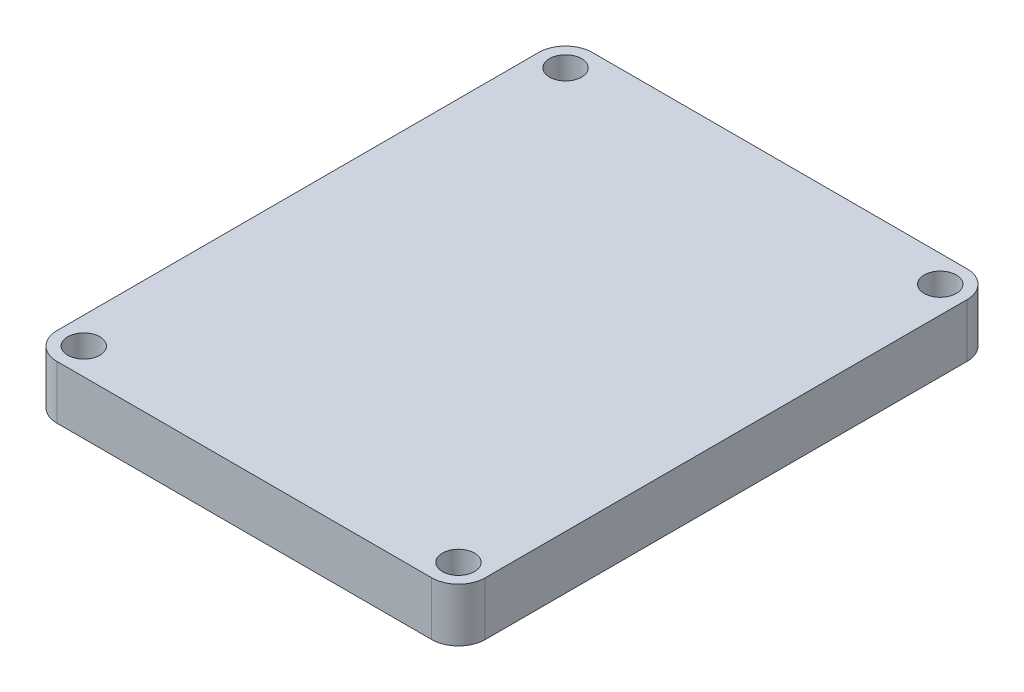
ISO-10303-21;
HEADER;
FILE_DESCRIPTION(('STEP AP214'),'2;1');
FILE_NAME('part.step','',(''),(''),'','','');
FILE_SCHEMA(('AUTOMOTIVE_DESIGN { 1 0 10303 214 1 1 1 1 }'));
ENDSEC;
DATA;
#1=APPLICATION_CONTEXT('core data for automotive mechanical design processes');
#2=APPLICATION_PROTOCOL_DEFINITION('international standard','automotive_design',2000,#1);
#3=PRODUCT_CONTEXT('',#1,'mechanical');
#4=PRODUCT('Part','Part','',(#3));
#5=PRODUCT_RELATED_PRODUCT_CATEGORY('part','',(#4));
#6=PRODUCT_DEFINITION_FORMATION('','',#4);
#7=PRODUCT_DEFINITION_CONTEXT('part definition',#1,'design');
#8=PRODUCT_DEFINITION('design','',#6,#7);
#9=PRODUCT_DEFINITION_SHAPE('','',#8);
#10=(LENGTH_UNIT() NAMED_UNIT(*) SI_UNIT(.MILLI.,.METRE.));
#11=(NAMED_UNIT(*) PLANE_ANGLE_UNIT() SI_UNIT($,.RADIAN.));
#12=(NAMED_UNIT(*) SI_UNIT($,.STERADIAN.) SOLID_ANGLE_UNIT());
#13=UNCERTAINTY_MEASURE_WITH_UNIT(LENGTH_MEASURE(1.E-05),#10,'distance_accuracy_value','');
#14=(GEOMETRIC_REPRESENTATION_CONTEXT(3) GLOBAL_UNCERTAINTY_ASSIGNED_CONTEXT((#13)) GLOBAL_UNIT_ASSIGNED_CONTEXT((#10,
#11,#12)) REPRESENTATION_CONTEXT('',''));
#15=CARTESIAN_POINT('',(0.,0.,0.));
#16=DIRECTION('',(0.,0.,1.));
#17=DIRECTION('',(1.,0.,0.));
#18=AXIS2_PLACEMENT_3D('',#15,#16,#17);
#19=CARTESIAN_POINT('',(-70.6896481169129,10.,0.));
#20=DIRECTION('',(1.,0.,0.));
#21=DIRECTION('',(0.,0.,-1.));
#22=AXIS2_PLACEMENT_3D('',#19,#20,#21);
#23=PLANE('',#22);
#24=DIRECTION('',(0.,0.,1.));
#25=VECTOR('',#24,1.);
#26=CARTESIAN_POINT('',(-70.6896481169129,10.,0.));
#27=LINE('',#26,#25);
#28=CARTESIAN_POINT('',(-70.6896481169129,10.,-35.7852502702385));
#29=VERTEX_POINT('',#28);
#30=CARTESIAN_POINT('',(-70.6896481169129,10.,54.2147497297615));
#31=VERTEX_POINT('',#30);
#32=EDGE_CURVE('E201',#29,#31,#27,.T.);
#33=ORIENTED_EDGE('',*,*,#32,.F.);
#34=DIRECTION('',(0.,-1.,0.));
#35=VECTOR('',#34,1.);
#36=CARTESIAN_POINT('',(-70.6896481169129,0.,-35.7852502702385));
#37=LINE('',#36,#35);
#38=CARTESIAN_POINT('',(-70.6896481169129,0.,-35.7852502702385));
#39=VERTEX_POINT('',#38);
#40=EDGE_CURVE('E11',#29,#39,#37,.T.);
#41=ORIENTED_EDGE('',*,*,#40,.T.);
#42=DIRECTION('',(0.,0.,1.));
#43=VECTOR('',#42,1.);
#44=CARTESIAN_POINT('',(-70.6896481169129,0.,0.));
#45=LINE('',#44,#43);
#46=CARTESIAN_POINT('',(-70.6896481169129,0.,54.2147497297615));
#47=VERTEX_POINT('',#46);
#48=EDGE_CURVE('E139',#39,#47,#45,.T.);
#49=ORIENTED_EDGE('',*,*,#48,.T.);
#50=DIRECTION('',(0.,-1.,0.));
#51=VECTOR('',#50,1.);
#52=CARTESIAN_POINT('',(-70.6896481169129,10.,54.2147497297615));
#53=LINE('',#52,#51);
#54=EDGE_CURVE('E116',#47,#31,#53,.F.);
#55=ORIENTED_EDGE('',*,*,#54,.T.);
#56=EDGE_LOOP('',(#33,#41,#49,#55));
#57=FACE_BOUND('',#56,.T.);
#58=ADVANCED_FACE('F41',(#57),#23,.F.);
#59=CARTESIAN_POINT('',(0.,10.,59.2147497297615));
#60=DIRECTION('',(0.,0.,-1.));
#61=DIRECTION('',(-1.,0.,0.));
#62=AXIS2_PLACEMENT_3D('',#59,#60,#61);
#63=PLANE('',#62);
#64=DIRECTION('',(1.,0.,0.));
#65=VECTOR('',#64,1.);
#66=CARTESIAN_POINT('',(0.,0.,59.2147497297615));
#67=LINE('',#66,#65);
#68=CARTESIAN_POINT('',(-65.6896481169129,0.,59.2147497297615));
#69=VERTEX_POINT('',#68);
#70=CARTESIAN_POINT('',(4.31035188308713,0.,59.2147497297615));
#71=VERTEX_POINT('',#70);
#72=EDGE_CURVE('E126',#69,#71,#67,.T.);
#73=ORIENTED_EDGE('',*,*,#72,.T.);
#74=DIRECTION('',(0.,-1.,0.));
#75=VECTOR('',#74,1.);
#76=CARTESIAN_POINT('',(4.31035188308713,10.,59.2147497297615));
#77=LINE('',#76,#75);
#78=CARTESIAN_POINT('',(4.31035188308713,10.,59.2147497297615));
#79=VERTEX_POINT('',#78);
#80=EDGE_CURVE('E177',#71,#79,#77,.F.);
#81=ORIENTED_EDGE('',*,*,#80,.T.);
#82=DIRECTION('',(1.,0.,0.));
#83=VECTOR('',#82,1.);
#84=CARTESIAN_POINT('',(0.,10.,59.2147497297615));
#85=LINE('',#84,#83);
#86=CARTESIAN_POINT('',(-65.6896481169129,10.,59.2147497297615));
#87=VERTEX_POINT('',#86);
#88=EDGE_CURVE('E129',#87,#79,#85,.T.);
#89=ORIENTED_EDGE('',*,*,#88,.F.);
#90=DIRECTION('',(0.,-1.,0.));
#91=VECTOR('',#90,1.);
#92=CARTESIAN_POINT('',(-65.6896481169129,10.,59.2147497297615));
#93=LINE('',#92,#91);
#94=EDGE_CURVE('E114',#87,#69,#93,.T.);
#95=ORIENTED_EDGE('',*,*,#94,.T.);
#96=EDGE_LOOP('',(#73,#81,#89,#95));
#97=FACE_BOUND('',#96,.T.);
#98=ADVANCED_FACE('F125',(#97),#63,.F.);
#99=CARTESIAN_POINT('',(9.31035188308713,10.,0.));
#100=DIRECTION('',(1.,0.,0.));
#101=DIRECTION('',(0.,0.,-1.));
#102=AXIS2_PLACEMENT_3D('',#99,#100,#101);
#103=PLANE('',#102);
#104=DIRECTION('',(0.,0.,1.));
#105=VECTOR('',#104,1.);
#106=CARTESIAN_POINT('',(9.31035188308713,10.,0.));
#107=LINE('',#106,#105);
#108=CARTESIAN_POINT('',(9.31035188308713,10.,-35.7852502702385));
#109=VERTEX_POINT('',#108);
#110=CARTESIAN_POINT('',(9.31035188308713,10.,54.2147497297615));
#111=VERTEX_POINT('',#110);
#112=EDGE_CURVE('E207',#109,#111,#107,.T.);
#113=ORIENTED_EDGE('',*,*,#112,.T.);
#114=DIRECTION('',(0.,-1.,0.));
#115=VECTOR('',#114,1.);
#116=CARTESIAN_POINT('',(9.31035188308713,0.,54.2147497297615));
#117=LINE('',#116,#115);
#118=CARTESIAN_POINT('',(9.31035188308713,0.,54.2147497297615));
#119=VERTEX_POINT('',#118);
#120=EDGE_CURVE('E165',#111,#119,#117,.T.);
#121=ORIENTED_EDGE('',*,*,#120,.T.);
#122=DIRECTION('',(0.,0.,1.));
#123=VECTOR('',#122,1.);
#124=CARTESIAN_POINT('',(9.31035188308713,0.,0.));
#125=LINE('',#124,#123);
#126=CARTESIAN_POINT('',(9.31035188308713,0.,-35.7852502702385));
#127=VERTEX_POINT('',#126);
#128=EDGE_CURVE('E138',#127,#119,#125,.T.);
#129=ORIENTED_EDGE('',*,*,#128,.F.);
#130=DIRECTION('',(0.,-1.,0.));
#131=VECTOR('',#130,1.);
#132=CARTESIAN_POINT('',(9.31035188308713,10.,-35.7852502702385));
#133=LINE('',#132,#131);
#134=EDGE_CURVE('E162',#127,#109,#133,.F.);
#135=ORIENTED_EDGE('',*,*,#134,.T.);
#136=EDGE_LOOP('',(#113,#121,#129,#135));
#137=FACE_BOUND('',#136,.T.);
#138=ADVANCED_FACE('F255',(#137),#103,.T.);
#139=CARTESIAN_POINT('',(0.,10.,-40.7852502702385));
#140=DIRECTION('',(0.,0.,-1.));
#141=DIRECTION('',(-1.,0.,0.));
#142=AXIS2_PLACEMENT_3D('',#139,#140,#141);
#143=PLANE('',#142);
#144=DIRECTION('',(1.,0.,0.));
#145=VECTOR('',#144,1.);
#146=CARTESIAN_POINT('',(0.,10.,-40.7852502702385));
#147=LINE('',#146,#145);
#148=CARTESIAN_POINT('',(-65.6896481169129,10.,-40.7852502702385));
#149=VERTEX_POINT('',#148);
#150=CARTESIAN_POINT('',(4.31035188308713,10.,-40.7852502702385));
#151=VERTEX_POINT('',#150);
#152=EDGE_CURVE('E193',#149,#151,#147,.T.);
#153=ORIENTED_EDGE('',*,*,#152,.T.);
#154=DIRECTION('',(0.,-1.,0.));
#155=VECTOR('',#154,1.);
#156=CARTESIAN_POINT('',(4.31035188308713,10.,-40.7852502702385));
#157=LINE('',#156,#155);
#158=CARTESIAN_POINT('',(4.31035188308713,0.,-40.7852502702385));
#159=VERTEX_POINT('',#158);
#160=EDGE_CURVE('E50',#151,#159,#157,.T.);
#161=ORIENTED_EDGE('',*,*,#160,.T.);
#162=DIRECTION('',(1.,0.,0.));
#163=VECTOR('',#162,1.);
#164=CARTESIAN_POINT('',(0.,0.,-40.7852502702385));
#165=LINE('',#164,#163);
#166=CARTESIAN_POINT('',(-65.6896481169129,0.,-40.7852502702385));
#167=VERTEX_POINT('',#166);
#168=EDGE_CURVE('E143',#167,#159,#165,.T.);
#169=ORIENTED_EDGE('',*,*,#168,.F.);
#170=DIRECTION('',(0.,-1.,0.));
#171=VECTOR('',#170,1.);
#172=CARTESIAN_POINT('',(-65.6896481169129,10.,-40.7852502702385));
#173=LINE('',#172,#171);
#174=EDGE_CURVE('E64',#167,#149,#173,.F.);
#175=ORIENTED_EDGE('',*,*,#174,.T.);
#176=EDGE_LOOP('',(#153,#161,#169,#175));
#177=FACE_BOUND('',#176,.T.);
#178=ADVANCED_FACE('F192',(#177),#143,.T.);
#179=CARTESIAN_POINT('',(-65.6896481169129,10.,-35.7852502702385));
#180=DIRECTION('',(0.,-1.,0.));
#181=DIRECTION('',(0.,0.,-1.));
#182=AXIS2_PLACEMENT_3D('',#179,#180,#181);
#183=CYLINDRICAL_SURFACE('',#182,3.00000000000001);
#184=CARTESIAN_POINT('',(-65.6896481169129,10.,-35.7852502702385));
#185=DIRECTION('',(0.,1.,0.));
#186=DIRECTION('',(0.,0.,1.));
#187=AXIS2_PLACEMENT_3D('',#184,#185,#186);
#188=CIRCLE('',#187,3.00000000000001);
#189=CARTESIAN_POINT('',(-65.6896481169129,10.,-32.7852502702385));
#190=VERTEX_POINT('',#189);
#191=EDGE_CURVE('E203',#190,#190,#188,.F.);
#192=ORIENTED_EDGE('',*,*,#191,.F.);
#193=EDGE_LOOP('',(#192));
#194=FACE_BOUND('',#193,.T.);
#195=CARTESIAN_POINT('',(-65.6896481169129,0.,-35.7852502702385));
#196=DIRECTION('',(0.,1.,0.));
#197=DIRECTION('',(0.,0.,1.));
#198=AXIS2_PLACEMENT_3D('',#195,#196,#197);
#199=CIRCLE('',#198,3.00000000000001);
#200=CARTESIAN_POINT('',(-65.6896481169129,0.,-32.7852502702385));
#201=VERTEX_POINT('',#200);
#202=EDGE_CURVE('E145',#201,#201,#199,.F.);
#203=ORIENTED_EDGE('',*,*,#202,.T.);
#204=EDGE_LOOP('',(#203));
#205=FACE_BOUND('',#204,.T.);
#206=ADVANCED_FACE('F233',(#194,#205),#183,.F.);
#207=CARTESIAN_POINT('',(4.31035188308708,10.,-35.7852502702385));
#208=DIRECTION('',(0.,-1.,0.));
#209=DIRECTION('',(0.,0.,-1.));
#210=AXIS2_PLACEMENT_3D('',#207,#208,#209);
#211=CYLINDRICAL_SURFACE('',#210,3.00000000000001);
#212=CARTESIAN_POINT('',(4.31035188308708,10.,-35.7852502702385));
#213=DIRECTION('',(0.,1.,0.));
#214=DIRECTION('',(0.,0.,1.));
#215=AXIS2_PLACEMENT_3D('',#212,#213,#214);
#216=CIRCLE('',#215,3.00000000000001);
#217=CARTESIAN_POINT('',(4.31035188308708,10.,-32.7852502702385));
#218=VERTEX_POINT('',#217);
#219=EDGE_CURVE('E210',#218,#218,#216,.T.);
#220=ORIENTED_EDGE('',*,*,#219,.T.);
#221=EDGE_LOOP('',(#220));
#222=FACE_BOUND('',#221,.T.);
#223=CARTESIAN_POINT('',(4.31035188308708,0.,-35.7852502702385));
#224=DIRECTION('',(0.,1.,0.));
#225=DIRECTION('',(0.,0.,1.));
#226=AXIS2_PLACEMENT_3D('',#223,#224,#225);
#227=CIRCLE('',#226,3.00000000000001);
#228=CARTESIAN_POINT('',(4.31035188308708,0.,-32.7852502702385));
#229=VERTEX_POINT('',#228);
#230=EDGE_CURVE('E226',#229,#229,#227,.T.);
#231=ORIENTED_EDGE('',*,*,#230,.F.);
#232=EDGE_LOOP('',(#231));
#233=FACE_BOUND('',#232,.T.);
#234=ADVANCED_FACE('F261',(#222,#233),#211,.F.);
#235=CARTESIAN_POINT('',(-65.6896481169129,10.,54.2147497297615));
#236=DIRECTION('',(0.,-1.,0.));
#237=DIRECTION('',(0.,0.,-1.));
#238=AXIS2_PLACEMENT_3D('',#235,#236,#237);
#239=CYLINDRICAL_SURFACE('',#238,3.00000000000001);
#240=CARTESIAN_POINT('',(-65.6896481169129,10.,54.2147497297615));
#241=DIRECTION('',(0.,1.,0.));
#242=DIRECTION('',(0.,0.,1.));
#243=AXIS2_PLACEMENT_3D('',#240,#241,#242);
#244=CIRCLE('',#243,3.00000000000001);
#245=CARTESIAN_POINT('',(-65.6896481169129,10.,57.2147497297615));
#246=VERTEX_POINT('',#245);
#247=EDGE_CURVE('E155',#246,#246,#244,.T.);
#248=ORIENTED_EDGE('',*,*,#247,.T.);
#249=EDGE_LOOP('',(#248));
#250=FACE_BOUND('',#249,.T.);
#251=CARTESIAN_POINT('',(-65.6896481169129,0.,54.2147497297615));
#252=DIRECTION('',(0.,1.,0.));
#253=DIRECTION('',(0.,0.,1.));
#254=AXIS2_PLACEMENT_3D('',#251,#252,#253);
#255=CIRCLE('',#254,3.00000000000001);
#256=CARTESIAN_POINT('',(-65.6896481169129,0.,57.2147497297615));
#257=VERTEX_POINT('',#256);
#258=EDGE_CURVE('E222',#257,#257,#255,.T.);
#259=ORIENTED_EDGE('',*,*,#258,.F.);
#260=EDGE_LOOP('',(#259));
#261=FACE_BOUND('',#260,.T.);
#262=ADVANCED_FACE('F265',(#250,#261),#239,.F.);
#263=CARTESIAN_POINT('',(4.31035188308711,10.,54.2147497297615));
#264=DIRECTION('',(0.,-1.,0.));
#265=DIRECTION('',(0.,0.,-1.));
#266=AXIS2_PLACEMENT_3D('',#263,#264,#265);
#267=CYLINDRICAL_SURFACE('',#266,3.00000000000001);
#268=CARTESIAN_POINT('',(4.31035188308711,10.,54.2147497297615));
#269=DIRECTION('',(0.,1.,0.));
#270=DIRECTION('',(0.,0.,1.));
#271=AXIS2_PLACEMENT_3D('',#268,#269,#270);
#272=CIRCLE('',#271,3.00000000000001);
#273=CARTESIAN_POINT('',(4.31035188308711,10.,57.2147497297615));
#274=VERTEX_POINT('',#273);
#275=EDGE_CURVE('E131',#274,#274,#272,.F.);
#276=ORIENTED_EDGE('',*,*,#275,.F.);
#277=EDGE_LOOP('',(#276));
#278=FACE_BOUND('',#277,.T.);
#279=CARTESIAN_POINT('',(4.31035188308711,0.,54.2147497297615));
#280=DIRECTION('',(0.,1.,0.));
#281=DIRECTION('',(0.,0.,1.));
#282=AXIS2_PLACEMENT_3D('',#279,#280,#281);
#283=CIRCLE('',#282,3.00000000000001);
#284=CARTESIAN_POINT('',(4.31035188308711,0.,57.2147497297615));
#285=VERTEX_POINT('',#284);
#286=EDGE_CURVE('E152',#285,#285,#283,.F.);
#287=ORIENTED_EDGE('',*,*,#286,.T.);
#288=EDGE_LOOP('',(#287));
#289=FACE_BOUND('',#288,.T.);
#290=ADVANCED_FACE('F245',(#278,#289),#267,.F.);
#291=CARTESIAN_POINT('',(0.,10.,0.));
#292=DIRECTION('',(0.,1.,0.));
#293=DIRECTION('',(0.,0.,1.));
#294=AXIS2_PLACEMENT_3D('',#291,#292,#293);
#295=PLANE('',#294);
#296=ORIENTED_EDGE('',*,*,#247,.F.);
#297=EDGE_LOOP('',(#296));
#298=FACE_BOUND('',#297,.T.);
#299=ORIENTED_EDGE('',*,*,#219,.F.);
#300=EDGE_LOOP('',(#299));
#301=FACE_BOUND('',#300,.T.);
#302=ORIENTED_EDGE('',*,*,#191,.T.);
#303=EDGE_LOOP('',(#302));
#304=FACE_BOUND('',#303,.T.);
#305=ORIENTED_EDGE('',*,*,#88,.T.);
#306=CARTESIAN_POINT('',(4.31035188308713,10.,54.2147497297615));
#307=DIRECTION('',(0.,1.,0.));
#308=DIRECTION('',(0.,0.,1.));
#309=AXIS2_PLACEMENT_3D('',#306,#307,#308);
#310=CIRCLE('',#309,5.);
#311=EDGE_CURVE('E185',#79,#111,#310,.T.);
#312=ORIENTED_EDGE('',*,*,#311,.T.);
#313=ORIENTED_EDGE('',*,*,#112,.F.);
#314=CARTESIAN_POINT('',(4.31035188308713,10.,-35.7852502702385));
#315=DIRECTION('',(0.,1.,0.));
#316=DIRECTION('',(0.,0.,1.));
#317=AXIS2_PLACEMENT_3D('',#314,#315,#316);
#318=CIRCLE('',#317,5.);
#319=EDGE_CURVE('E57',#109,#151,#318,.T.);
#320=ORIENTED_EDGE('',*,*,#319,.T.);
#321=ORIENTED_EDGE('',*,*,#152,.F.);
#322=CARTESIAN_POINT('',(-65.6896481169129,10.,-35.7852502702385));
#323=DIRECTION('',(0.,1.,0.));
#324=DIRECTION('',(0.,0.,1.));
#325=AXIS2_PLACEMENT_3D('',#322,#323,#324);
#326=CIRCLE('',#325,5.);
#327=EDGE_CURVE('E180',#149,#29,#326,.T.);
#328=ORIENTED_EDGE('',*,*,#327,.T.);
#329=ORIENTED_EDGE('',*,*,#32,.T.);
#330=CARTESIAN_POINT('',(-65.6896481169129,10.,54.2147497297615));
#331=DIRECTION('',(0.,1.,0.));
#332=DIRECTION('',(0.,0.,1.));
#333=AXIS2_PLACEMENT_3D('',#330,#331,#332);
#334=CIRCLE('',#333,5.);
#335=EDGE_CURVE('E159',#31,#87,#334,.T.);
#336=ORIENTED_EDGE('',*,*,#335,.T.);
#337=EDGE_LOOP('',(#305,#312,#313,#320,#321,#328,#329,#336));
#338=FACE_BOUND('',#337,.T.);
#339=ORIENTED_EDGE('',*,*,#275,.T.);
#340=EDGE_LOOP('',(#339));
#341=FACE_BOUND('',#340,.T.);
#342=ADVANCED_FACE('F236',(#298,#301,#304,#338,#341),#295,.T.);
#343=CARTESIAN_POINT('',(0.,0.,0.));
#344=DIRECTION('',(0.,1.,0.));
#345=DIRECTION('',(0.,0.,1.));
#346=AXIS2_PLACEMENT_3D('',#343,#344,#345);
#347=PLANE('',#346);
#348=ORIENTED_EDGE('',*,*,#258,.T.);
#349=EDGE_LOOP('',(#348));
#350=FACE_BOUND('',#349,.T.);
#351=ORIENTED_EDGE('',*,*,#230,.T.);
#352=EDGE_LOOP('',(#351));
#353=FACE_BOUND('',#352,.T.);
#354=ORIENTED_EDGE('',*,*,#202,.F.);
#355=EDGE_LOOP('',(#354));
#356=FACE_BOUND('',#355,.T.);
#357=ORIENTED_EDGE('',*,*,#128,.T.);
#358=CARTESIAN_POINT('',(4.31035188308713,0.,54.2147497297615));
#359=DIRECTION('',(0.,1.,0.));
#360=DIRECTION('',(0.,0.,1.));
#361=AXIS2_PLACEMENT_3D('',#358,#359,#360);
#362=CIRCLE('',#361,5.);
#363=EDGE_CURVE('E136',#119,#71,#362,.F.);
#364=ORIENTED_EDGE('',*,*,#363,.T.);
#365=ORIENTED_EDGE('',*,*,#72,.F.);
#366=CARTESIAN_POINT('',(-65.6896481169129,0.,54.2147497297615));
#367=DIRECTION('',(0.,1.,0.));
#368=DIRECTION('',(0.,0.,1.));
#369=AXIS2_PLACEMENT_3D('',#366,#367,#368);
#370=CIRCLE('',#369,5.);
#371=EDGE_CURVE('E110',#69,#47,#370,.F.);
#372=ORIENTED_EDGE('',*,*,#371,.T.);
#373=ORIENTED_EDGE('',*,*,#48,.F.);
#374=CARTESIAN_POINT('',(-65.6896481169129,0.,-35.7852502702385));
#375=DIRECTION('',(0.,1.,0.));
#376=DIRECTION('',(0.,0.,1.));
#377=AXIS2_PLACEMENT_3D('',#374,#375,#376);
#378=CIRCLE('',#377,5.);
#379=EDGE_CURVE('E169',#39,#167,#378,.F.);
#380=ORIENTED_EDGE('',*,*,#379,.T.);
#381=ORIENTED_EDGE('',*,*,#168,.T.);
#382=CARTESIAN_POINT('',(4.31035188308713,0.,-35.7852502702385));
#383=DIRECTION('',(0.,1.,0.));
#384=DIRECTION('',(0.,0.,1.));
#385=AXIS2_PLACEMENT_3D('',#382,#383,#384);
#386=CIRCLE('',#385,5.);
#387=EDGE_CURVE('E172',#159,#127,#386,.F.);
#388=ORIENTED_EDGE('',*,*,#387,.T.);
#389=EDGE_LOOP('',(#357,#364,#365,#372,#373,#380,#381,#388));
#390=FACE_BOUND('',#389,.T.);
#391=ORIENTED_EDGE('',*,*,#286,.F.);
#392=EDGE_LOOP('',(#391));
#393=FACE_BOUND('',#392,.T.);
#394=ADVANCED_FACE('F134',(#350,#353,#356,#390,#393),#347,.F.);
#395=CARTESIAN_POINT('',(-65.6896481169129,10.,54.2147497297615));
#396=DIRECTION('',(0.,-1.,0.));
#397=DIRECTION('',(0.,0.,-1.));
#398=AXIS2_PLACEMENT_3D('',#395,#396,#397);
#399=CYLINDRICAL_SURFACE('',#398,5.);
#400=ORIENTED_EDGE('',*,*,#335,.F.);
#401=ORIENTED_EDGE('',*,*,#54,.F.);
#402=ORIENTED_EDGE('',*,*,#371,.F.);
#403=ORIENTED_EDGE('',*,*,#94,.F.);
#404=EDGE_LOOP('',(#400,#401,#402,#403));
#405=FACE_BOUND('',#404,.T.);
#406=ADVANCED_FACE('F113',(#405),#399,.T.);
#407=CARTESIAN_POINT('',(4.31035188308713,10.,54.2147497297615));
#408=DIRECTION('',(0.,1.,0.));
#409=DIRECTION('',(0.,0.,1.));
#410=AXIS2_PLACEMENT_3D('',#407,#408,#409);
#411=CYLINDRICAL_SURFACE('',#410,5.);
#412=ORIENTED_EDGE('',*,*,#311,.F.);
#413=ORIENTED_EDGE('',*,*,#80,.F.);
#414=ORIENTED_EDGE('',*,*,#363,.F.);
#415=ORIENTED_EDGE('',*,*,#120,.F.);
#416=EDGE_LOOP('',(#412,#413,#414,#415));
#417=FACE_BOUND('',#416,.T.);
#418=ADVANCED_FACE('F243',(#417),#411,.T.);
#419=CARTESIAN_POINT('',(4.31035188308713,10.,-35.7852502702385));
#420=DIRECTION('',(0.,-1.,0.));
#421=DIRECTION('',(0.,0.,-1.));
#422=AXIS2_PLACEMENT_3D('',#419,#420,#421);
#423=CYLINDRICAL_SURFACE('',#422,5.);
#424=ORIENTED_EDGE('',*,*,#319,.F.);
#425=ORIENTED_EDGE('',*,*,#134,.F.);
#426=ORIENTED_EDGE('',*,*,#387,.F.);
#427=ORIENTED_EDGE('',*,*,#160,.F.);
#428=EDGE_LOOP('',(#424,#425,#426,#427));
#429=FACE_BOUND('',#428,.T.);
#430=ADVANCED_FACE('F271',(#429),#423,.T.);
#431=CARTESIAN_POINT('',(-65.6896481169129,10.,-35.7852502702385));
#432=DIRECTION('',(0.,1.,0.));
#433=DIRECTION('',(0.,0.,1.));
#434=AXIS2_PLACEMENT_3D('',#431,#432,#433);
#435=CYLINDRICAL_SURFACE('',#434,5.);
#436=ORIENTED_EDGE('',*,*,#327,.F.);
#437=ORIENTED_EDGE('',*,*,#174,.F.);
#438=ORIENTED_EDGE('',*,*,#379,.F.);
#439=ORIENTED_EDGE('',*,*,#40,.F.);
#440=EDGE_LOOP('',(#436,#437,#438,#439));
#441=FACE_BOUND('',#440,.T.);
#442=ADVANCED_FACE('F43',(#441),#435,.T.);
#443=CLOSED_SHELL('',(#58,#98,#138,#178,#206,#234,#262,#290,#342,#394,#406,#418,#430,#442));
#444=MANIFOLD_SOLID_BREP('B2',#443);
#445=ADVANCED_BREP_SHAPE_REPRESENTATION('',(#18,#444),#14);
#446=SHAPE_DEFINITION_REPRESENTATION(#9,#445);
ENDSEC;
END-ISO-10303-21;
